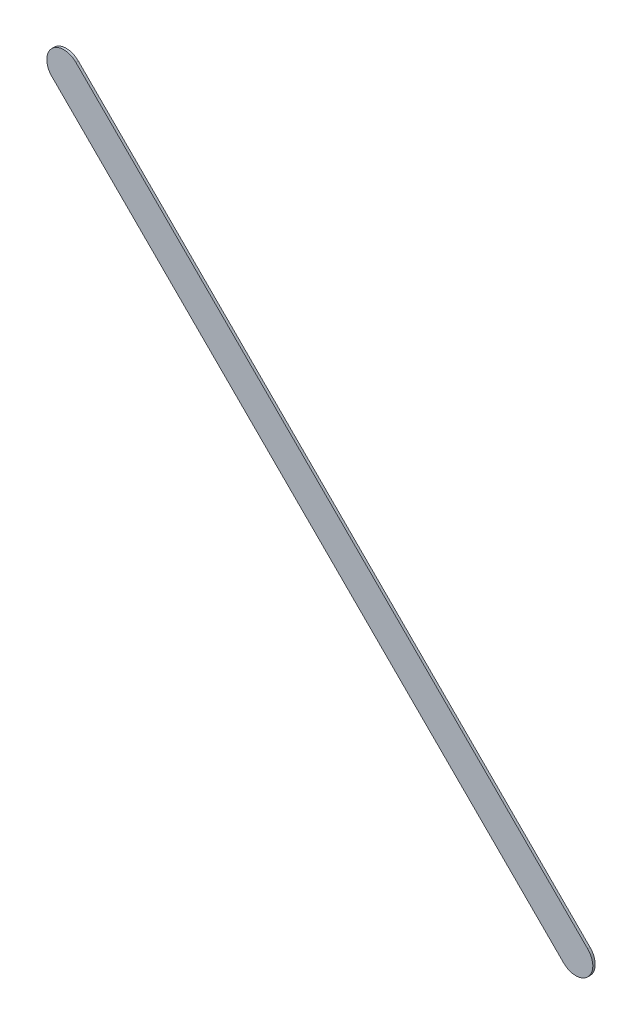
ISO-10303-21;
HEADER;
FILE_DESCRIPTION(('STEP AP214'),'2;1');
FILE_NAME('part.step','',(''),(''),'','','');
FILE_SCHEMA(('AUTOMOTIVE_DESIGN { 1 0 10303 214 1 1 1 1 }'));
ENDSEC;
DATA;
#1=APPLICATION_CONTEXT('core data for automotive mechanical design processes');
#2=APPLICATION_PROTOCOL_DEFINITION('international standard','automotive_design',2000,#1);
#3=PRODUCT_CONTEXT('',#1,'mechanical');
#4=PRODUCT('Part','Part','',(#3));
#5=PRODUCT_RELATED_PRODUCT_CATEGORY('part','',(#4));
#6=PRODUCT_DEFINITION_FORMATION('','',#4);
#7=PRODUCT_DEFINITION_CONTEXT('part definition',#1,'design');
#8=PRODUCT_DEFINITION('design','',#6,#7);
#9=PRODUCT_DEFINITION_SHAPE('','',#8);
#10=(LENGTH_UNIT() NAMED_UNIT(*) SI_UNIT(.MILLI.,.METRE.));
#11=(NAMED_UNIT(*) PLANE_ANGLE_UNIT() SI_UNIT($,.RADIAN.));
#12=(NAMED_UNIT(*) SI_UNIT($,.STERADIAN.) SOLID_ANGLE_UNIT());
#13=UNCERTAINTY_MEASURE_WITH_UNIT(LENGTH_MEASURE(1.E-05),#10,'distance_accuracy_value','');
#14=(GEOMETRIC_REPRESENTATION_CONTEXT(3) GLOBAL_UNCERTAINTY_ASSIGNED_CONTEXT((#13)) GLOBAL_UNIT_ASSIGNED_CONTEXT((#10,
#11,#12)) REPRESENTATION_CONTEXT('',''));
#15=CARTESIAN_POINT('',(0.,0.,0.));
#16=DIRECTION('',(0.,0.,1.));
#17=DIRECTION('',(1.,0.,0.));
#18=AXIS2_PLACEMENT_3D('',#15,#16,#17);
#19=CARTESIAN_POINT('',(67.79462438,71.32322286,0.));
#20=DIRECTION('',(0.707106781186547,0.707106781186548,0.));
#21=DIRECTION('',(0.707106781186548,-0.707106781186547,0.));
#22=AXIS2_PLACEMENT_3D('',#19,#20,#21);
#23=PLANE('',#22);
#24=DIRECTION('',(0.707106781186548,-0.707106781186547,0.));
#25=VECTOR('',#24,1.);
#26=CARTESIAN_POINT('',(67.79462438,71.32322286,0.03556));
#27=LINE('',#26,#25);
#28=CARTESIAN_POINT('',(67.79462438,71.32322286,0.03556));
#29=VERTEX_POINT('',#28);
#30=CARTESIAN_POINT('',(75.29462462,63.82322262,0.03556));
#31=VERTEX_POINT('',#30);
#32=EDGE_CURVE('E11',#29,#31,#27,.T.);
#33=ORIENTED_EDGE('',*,*,#32,.F.);
#34=DIRECTION('',(0.,0.,1.));
#35=VECTOR('',#34,1.);
#36=CARTESIAN_POINT('',(67.79462438,71.32322286,0.));
#37=LINE('',#36,#35);
#38=CARTESIAN_POINT('',(67.79462438,71.32322286,0.));
#39=VERTEX_POINT('',#38);
#40=EDGE_CURVE('E24',#39,#29,#37,.T.);
#41=ORIENTED_EDGE('',*,*,#40,.F.);
#42=DIRECTION('',(0.707106781186548,-0.707106781186547,0.));
#43=VECTOR('',#42,1.);
#44=CARTESIAN_POINT('',(67.79462438,71.32322286,0.));
#45=LINE('',#44,#43);
#46=CARTESIAN_POINT('',(75.29462462,63.82322262,0.));
#47=VERTEX_POINT('',#46);
#48=EDGE_CURVE('E75',#39,#47,#45,.T.);
#49=ORIENTED_EDGE('',*,*,#48,.T.);
#50=DIRECTION('',(0.,0.,1.));
#51=VECTOR('',#50,1.);
#52=CARTESIAN_POINT('',(75.29462462,63.82322262,0.));
#53=LINE('',#52,#51);
#54=EDGE_CURVE('E37',#47,#31,#53,.T.);
#55=ORIENTED_EDGE('',*,*,#54,.T.);
#56=EDGE_LOOP('',(#33,#41,#49,#55));
#57=FACE_BOUND('',#56,.T.);
#58=ADVANCED_FACE('F17',(#57),#23,.F.);
#59=CARTESIAN_POINT('',(75.471401,63.999999,0.));
#60=DIRECTION('',(0.,0.,-1.));
#61=DIRECTION('',(-0.707106781186533,-0.707106781186562,0.));
#62=AXIS2_PLACEMENT_3D('',#59,#60,#61);
#63=CYLINDRICAL_SURFACE('',#62,0.249999554103223);
#64=CARTESIAN_POINT('',(75.471401,63.999999,0.03556));
#65=DIRECTION('',(0.,0.,1.));
#66=DIRECTION('',(-0.707106781186533,-0.707106781186562,0.));
#67=AXIS2_PLACEMENT_3D('',#64,#65,#66);
#68=CIRCLE('',#67,0.249999554103223);
#69=CARTESIAN_POINT('',(75.64817738,64.17677538,0.03556));
#70=VERTEX_POINT('',#69);
#71=EDGE_CURVE('E83',#31,#70,#68,.T.);
#72=ORIENTED_EDGE('',*,*,#71,.F.);
#73=ORIENTED_EDGE('',*,*,#54,.F.);
#74=CARTESIAN_POINT('',(75.471401,63.999999,0.));
#75=DIRECTION('',(0.,0.,1.));
#76=DIRECTION('',(-0.707106781186533,-0.707106781186562,0.));
#77=AXIS2_PLACEMENT_3D('',#74,#75,#76);
#78=CIRCLE('',#77,0.249999554103223);
#79=CARTESIAN_POINT('',(75.64817738,64.17677538,0.));
#80=VERTEX_POINT('',#79);
#81=EDGE_CURVE('E81',#47,#80,#78,.T.);
#82=ORIENTED_EDGE('',*,*,#81,.T.);
#83=DIRECTION('',(0.,0.,1.));
#84=VECTOR('',#83,1.);
#85=CARTESIAN_POINT('',(75.64817738,64.17677538,0.));
#86=LINE('',#85,#84);
#87=EDGE_CURVE('E67',#80,#70,#86,.T.);
#88=ORIENTED_EDGE('',*,*,#87,.T.);
#89=EDGE_LOOP('',(#72,#73,#82,#88));
#90=FACE_BOUND('',#89,.T.);
#91=ADVANCED_FACE('F89',(#90),#63,.T.);
#92=CARTESIAN_POINT('',(75.64817738,64.17677538,0.));
#93=DIRECTION('',(-0.707106781186548,-0.707106781186547,0.));
#94=DIRECTION('',(-0.707106781186547,0.707106781186548,0.));
#95=AXIS2_PLACEMENT_3D('',#92,#93,#94);
#96=PLANE('',#95);
#97=DIRECTION('',(-0.707106781186547,0.707106781186548,0.));
#98=VECTOR('',#97,1.);
#99=CARTESIAN_POINT('',(75.64817738,64.17677538,0.03556));
#100=LINE('',#99,#98);
#101=CARTESIAN_POINT('',(68.14817714,71.67677562,0.03556));
#102=VERTEX_POINT('',#101);
#103=EDGE_CURVE('E71',#70,#102,#100,.T.);
#104=ORIENTED_EDGE('',*,*,#103,.F.);
#105=ORIENTED_EDGE('',*,*,#87,.F.);
#106=DIRECTION('',(-0.707106781186547,0.707106781186548,0.));
#107=VECTOR('',#106,1.);
#108=CARTESIAN_POINT('',(75.64817738,64.17677538,0.));
#109=LINE('',#108,#107);
#110=CARTESIAN_POINT('',(68.14817714,71.67677562,0.));
#111=VERTEX_POINT('',#110);
#112=EDGE_CURVE('E63',#80,#111,#109,.T.);
#113=ORIENTED_EDGE('',*,*,#112,.T.);
#114=DIRECTION('',(0.,0.,1.));
#115=VECTOR('',#114,1.);
#116=CARTESIAN_POINT('',(68.14817714,71.67677562,0.));
#117=LINE('',#116,#115);
#118=EDGE_CURVE('E53',#111,#102,#117,.T.);
#119=ORIENTED_EDGE('',*,*,#118,.T.);
#120=EDGE_LOOP('',(#104,#105,#113,#119));
#121=FACE_BOUND('',#120,.T.);
#122=ADVANCED_FACE('F66',(#121),#96,.F.);
#123=CARTESIAN_POINT('',(67.97140076,71.49999924,0.));
#124=DIRECTION('',(0.,0.,-1.));
#125=DIRECTION('',(0.707106781186548,0.707106781186548,0.));
#126=AXIS2_PLACEMENT_3D('',#123,#124,#125);
#127=CYLINDRICAL_SURFACE('',#126,0.24999955410323);
#128=CARTESIAN_POINT('',(67.97140076,71.49999924,0.03556));
#129=DIRECTION('',(0.,0.,1.));
#130=DIRECTION('',(0.707106781186548,0.707106781186548,0.));
#131=AXIS2_PLACEMENT_3D('',#128,#129,#130);
#132=CIRCLE('',#131,0.24999955410323);
#133=EDGE_CURVE('E59',#102,#29,#132,.T.);
#134=ORIENTED_EDGE('',*,*,#133,.F.);
#135=ORIENTED_EDGE('',*,*,#118,.F.);
#136=CARTESIAN_POINT('',(67.97140076,71.49999924,0.));
#137=DIRECTION('',(0.,0.,1.));
#138=DIRECTION('',(0.707106781186548,0.707106781186548,0.));
#139=AXIS2_PLACEMENT_3D('',#136,#137,#138);
#140=CIRCLE('',#139,0.24999955410323);
#141=EDGE_CURVE('E57',#111,#39,#140,.T.);
#142=ORIENTED_EDGE('',*,*,#141,.T.);
#143=ORIENTED_EDGE('',*,*,#40,.T.);
#144=EDGE_LOOP('',(#134,#135,#142,#143));
#145=FACE_BOUND('',#144,.T.);
#146=ADVANCED_FACE('F55',(#145),#127,.T.);
#147=CARTESIAN_POINT('',(67.79462438,71.32322286,0.));
#148=DIRECTION('',(0.,0.,-1.));
#149=DIRECTION('',(-1.,0.,0.));
#150=AXIS2_PLACEMENT_3D('',#147,#148,#149);
#151=PLANE('',#150);
#152=ORIENTED_EDGE('',*,*,#141,.F.);
#153=ORIENTED_EDGE('',*,*,#112,.F.);
#154=ORIENTED_EDGE('',*,*,#81,.F.);
#155=ORIENTED_EDGE('',*,*,#48,.F.);
#156=EDGE_LOOP('',(#152,#153,#154,#155));
#157=FACE_BOUND('',#156,.T.);
#158=ADVANCED_FACE('F74',(#157),#151,.T.);
#159=CARTESIAN_POINT('',(67.79462438,71.32322286,0.03556));
#160=DIRECTION('',(0.,0.,-1.));
#161=DIRECTION('',(-1.,0.,0.));
#162=AXIS2_PLACEMENT_3D('',#159,#160,#161);
#163=PLANE('',#162);
#164=ORIENTED_EDGE('',*,*,#32,.T.);
#165=ORIENTED_EDGE('',*,*,#71,.T.);
#166=ORIENTED_EDGE('',*,*,#103,.T.);
#167=ORIENTED_EDGE('',*,*,#133,.T.);
#168=EDGE_LOOP('',(#164,#165,#166,#167));
#169=FACE_BOUND('',#168,.T.);
#170=ADVANCED_FACE('F91',(#169),#163,.F.);
#171=CLOSED_SHELL('',(#58,#91,#122,#146,#158,#170));
#172=MANIFOLD_SOLID_BREP('B1',#171);
#173=ADVANCED_BREP_SHAPE_REPRESENTATION('',(#18,#172),#14);
#174=SHAPE_DEFINITION_REPRESENTATION(#9,#173);
ENDSEC;
END-ISO-10303-21;
